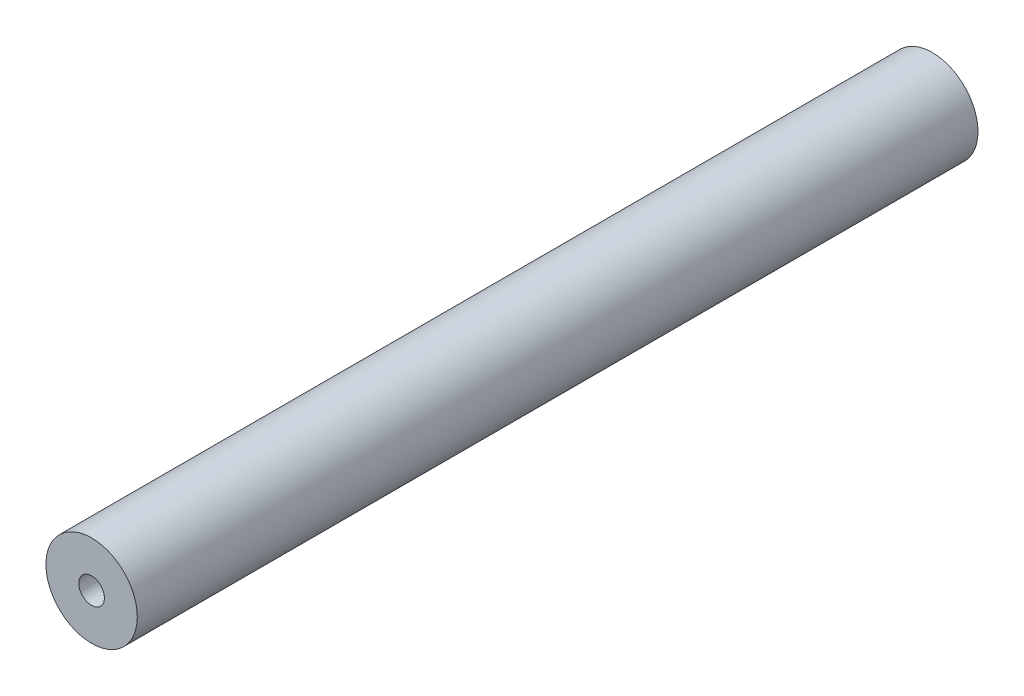
ISO-10303-21;
HEADER;
FILE_DESCRIPTION(('STEP AP214'),'2;1');
FILE_NAME('part.step','',(''),(''),'','','');
FILE_SCHEMA(('AUTOMOTIVE_DESIGN { 1 0 10303 214 1 1 1 1 }'));
ENDSEC;
DATA;
#1=APPLICATION_CONTEXT('core data for automotive mechanical design processes');
#2=APPLICATION_PROTOCOL_DEFINITION('international standard','automotive_design',2000,#1);
#3=PRODUCT_CONTEXT('',#1,'mechanical');
#4=PRODUCT('Part','Part','',(#3));
#5=PRODUCT_RELATED_PRODUCT_CATEGORY('part','',(#4));
#6=PRODUCT_DEFINITION_FORMATION('','',#4);
#7=PRODUCT_DEFINITION_CONTEXT('part definition',#1,'design');
#8=PRODUCT_DEFINITION('design','',#6,#7);
#9=PRODUCT_DEFINITION_SHAPE('','',#8);
#10=(LENGTH_UNIT() NAMED_UNIT(*) SI_UNIT(.MILLI.,.METRE.));
#11=(NAMED_UNIT(*) PLANE_ANGLE_UNIT() SI_UNIT($,.RADIAN.));
#12=(NAMED_UNIT(*) SI_UNIT($,.STERADIAN.) SOLID_ANGLE_UNIT());
#13=UNCERTAINTY_MEASURE_WITH_UNIT(LENGTH_MEASURE(1.E-05),#10,'distance_accuracy_value','');
#14=(GEOMETRIC_REPRESENTATION_CONTEXT(3) GLOBAL_UNCERTAINTY_ASSIGNED_CONTEXT((#13)) GLOBAL_UNIT_ASSIGNED_CONTEXT((#10,
#11,#12)) REPRESENTATION_CONTEXT('',''));
#15=CARTESIAN_POINT('',(0.,0.,0.));
#16=DIRECTION('',(0.,0.,1.));
#17=DIRECTION('',(1.,0.,0.));
#18=AXIS2_PLACEMENT_3D('',#15,#16,#17);
#19=CARTESIAN_POINT('',(0.,0.,584.2));
#20=DIRECTION('',(0.,0.,-1.));
#21=DIRECTION('',(-1.,0.,0.));
#22=AXIS2_PLACEMENT_3D('',#19,#20,#21);
#23=CYLINDRICAL_SURFACE('',#22,31.75);
#24=CARTESIAN_POINT('',(0.,0.,584.2));
#25=DIRECTION('',(0.,0.,1.));
#26=DIRECTION('',(1.,0.,0.));
#27=AXIS2_PLACEMENT_3D('',#24,#25,#26);
#28=CIRCLE('',#27,31.75);
#29=CARTESIAN_POINT('',(31.75,0.,584.2));
#30=VERTEX_POINT('',#29);
#31=EDGE_CURVE('E10',#30,#30,#28,.T.);
#32=ORIENTED_EDGE('',*,*,#31,.F.);
#33=EDGE_LOOP('',(#32));
#34=FACE_BOUND('',#33,.T.);
#35=CARTESIAN_POINT('',(0.,0.,0.));
#36=DIRECTION('',(0.,0.,1.));
#37=DIRECTION('',(1.,0.,0.));
#38=AXIS2_PLACEMENT_3D('',#35,#36,#37);
#39=CIRCLE('',#38,31.75);
#40=CARTESIAN_POINT('',(31.75,0.,0.));
#41=VERTEX_POINT('',#40);
#42=EDGE_CURVE('E38',#41,#41,#39,.T.);
#43=ORIENTED_EDGE('',*,*,#42,.T.);
#44=EDGE_LOOP('',(#43));
#45=FACE_BOUND('',#44,.T.);
#46=ADVANCED_FACE('F35',(#34,#45),#23,.T.);
#47=CARTESIAN_POINT('',(0.,0.,584.2));
#48=DIRECTION('',(0.,0.,1.));
#49=DIRECTION('',(1.,0.,0.));
#50=AXIS2_PLACEMENT_3D('',#47,#48,#49);
#51=PLANE('',#50);
#52=CARTESIAN_POINT('',(0.,0.,584.2));
#53=DIRECTION('',(0.,0.,-1.));
#54=DIRECTION('',(-1.,0.,0.));
#55=AXIS2_PLACEMENT_3D('',#52,#53,#54);
#56=CIRCLE('',#55,8.89);
#57=CARTESIAN_POINT('',(-8.89,0.,584.2));
#58=VERTEX_POINT('',#57);
#59=EDGE_CURVE('E48',#58,#58,#56,.T.);
#60=ORIENTED_EDGE('',*,*,#59,.T.);
#61=EDGE_LOOP('',(#60));
#62=FACE_BOUND('',#61,.T.);
#63=ORIENTED_EDGE('',*,*,#31,.T.);
#64=EDGE_LOOP('',(#63));
#65=FACE_BOUND('',#64,.T.);
#66=ADVANCED_FACE('F57',(#62,#65),#51,.T.);
#67=CARTESIAN_POINT('',(0.,0.,0.));
#68=DIRECTION('',(0.,0.,1.));
#69=DIRECTION('',(1.,0.,0.));
#70=AXIS2_PLACEMENT_3D('',#67,#68,#69);
#71=PLANE('',#70);
#72=CARTESIAN_POINT('',(0.,0.,0.));
#73=DIRECTION('',(0.,0.,-1.));
#74=DIRECTION('',(-1.,0.,0.));
#75=AXIS2_PLACEMENT_3D('',#72,#73,#74);
#76=CIRCLE('',#75,8.89);
#77=CARTESIAN_POINT('',(-8.89,0.,0.));
#78=VERTEX_POINT('',#77);
#79=EDGE_CURVE('E50',#78,#78,#76,.T.);
#80=ORIENTED_EDGE('',*,*,#79,.F.);
#81=EDGE_LOOP('',(#80));
#82=FACE_BOUND('',#81,.T.);
#83=ORIENTED_EDGE('',*,*,#42,.F.);
#84=EDGE_LOOP('',(#83));
#85=FACE_BOUND('',#84,.T.);
#86=ADVANCED_FACE('F62',(#82,#85),#71,.F.);
#87=CARTESIAN_POINT('',(0.,0.,584.2));
#88=DIRECTION('',(0.,0.,-1.));
#89=DIRECTION('',(-1.,0.,0.));
#90=AXIS2_PLACEMENT_3D('',#87,#88,#89);
#91=CYLINDRICAL_SURFACE('',#90,8.89);
#92=ORIENTED_EDGE('',*,*,#59,.F.);
#93=EDGE_LOOP('',(#92));
#94=FACE_BOUND('',#93,.T.);
#95=ORIENTED_EDGE('',*,*,#79,.T.);
#96=EDGE_LOOP('',(#95));
#97=FACE_BOUND('',#96,.T.);
#98=ADVANCED_FACE('F59',(#94,#97),#91,.F.);
#99=CLOSED_SHELL('',(#46,#66,#86,#98));
#100=MANIFOLD_SOLID_BREP('B2',#99);
#101=ADVANCED_BREP_SHAPE_REPRESENTATION('',(#18,#100),#14);
#102=SHAPE_DEFINITION_REPRESENTATION(#9,#101);
ENDSEC;
END-ISO-10303-21;
